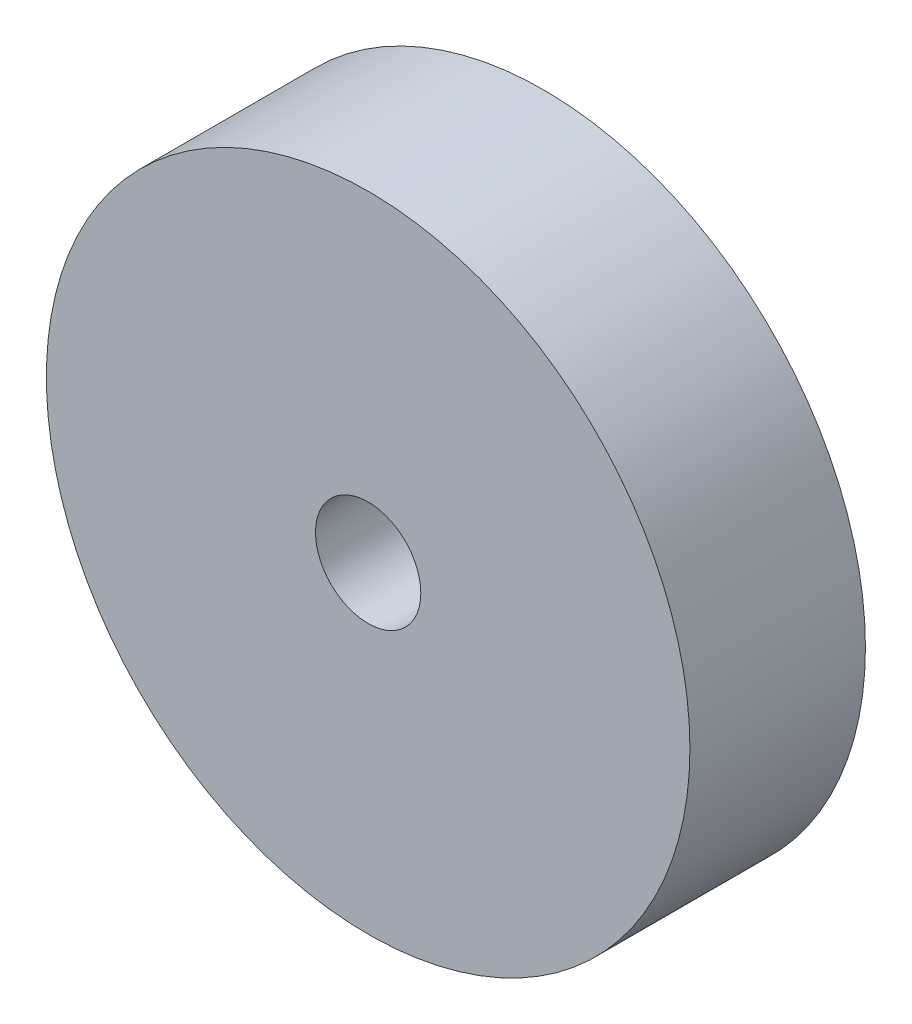
ISO-10303-21;
HEADER;
FILE_DESCRIPTION(('STEP AP214'),'2;1');
FILE_NAME('part.step','',(''),(''),'','','');
FILE_SCHEMA(('AUTOMOTIVE_DESIGN { 1 0 10303 214 1 1 1 1 }'));
ENDSEC;
DATA;
#1=APPLICATION_CONTEXT('core data for automotive mechanical design processes');
#2=APPLICATION_PROTOCOL_DEFINITION('international standard','automotive_design',2000,#1);
#3=PRODUCT_CONTEXT('',#1,'mechanical');
#4=PRODUCT('Part','Part','',(#3));
#5=PRODUCT_RELATED_PRODUCT_CATEGORY('part','',(#4));
#6=PRODUCT_DEFINITION_FORMATION('','',#4);
#7=PRODUCT_DEFINITION_CONTEXT('part definition',#1,'design');
#8=PRODUCT_DEFINITION('design','',#6,#7);
#9=PRODUCT_DEFINITION_SHAPE('','',#8);
#10=(LENGTH_UNIT() NAMED_UNIT(*) SI_UNIT(.MILLI.,.METRE.));
#11=(NAMED_UNIT(*) PLANE_ANGLE_UNIT() SI_UNIT($,.RADIAN.));
#12=(NAMED_UNIT(*) SI_UNIT($,.STERADIAN.) SOLID_ANGLE_UNIT());
#13=UNCERTAINTY_MEASURE_WITH_UNIT(LENGTH_MEASURE(1.E-05),#10,'distance_accuracy_value','');
#14=(GEOMETRIC_REPRESENTATION_CONTEXT(3) GLOBAL_UNCERTAINTY_ASSIGNED_CONTEXT((#13)) GLOBAL_UNIT_ASSIGNED_CONTEXT((#10,
#11,#12)) REPRESENTATION_CONTEXT('',''));
#15=CARTESIAN_POINT('',(0.,0.,0.));
#16=DIRECTION('',(0.,0.,1.));
#17=DIRECTION('',(1.,0.,0.));
#18=AXIS2_PLACEMENT_3D('',#15,#16,#17);
#19=CARTESIAN_POINT('',(0.,0.,3.));
#20=DIRECTION('',(0.,0.,-1.));
#21=DIRECTION('',(-1.,0.,0.));
#22=AXIS2_PLACEMENT_3D('',#19,#20,#21);
#23=CYLINDRICAL_SURFACE('',#22,0.9);
#24=CARTESIAN_POINT('',(0.,0.,3.));
#25=DIRECTION('',(0.,0.,1.));
#26=DIRECTION('',(1.,0.,0.));
#27=AXIS2_PLACEMENT_3D('',#24,#25,#26);
#28=CIRCLE('',#27,0.9);
#29=CARTESIAN_POINT('',(0.9,0.,3.));
#30=VERTEX_POINT('',#29);
#31=EDGE_CURVE('E38',#30,#30,#28,.T.);
#32=ORIENTED_EDGE('',*,*,#31,.T.);
#33=EDGE_LOOP('',(#32));
#34=FACE_BOUND('',#33,.T.);
#35=CARTESIAN_POINT('',(0.,0.,0.));
#36=DIRECTION('',(0.,0.,1.));
#37=DIRECTION('',(1.,0.,0.));
#38=AXIS2_PLACEMENT_3D('',#35,#36,#37);
#39=CIRCLE('',#38,0.9);
#40=CARTESIAN_POINT('',(0.9,0.,0.));
#41=VERTEX_POINT('',#40);
#42=EDGE_CURVE('E44',#41,#41,#39,.T.);
#43=ORIENTED_EDGE('',*,*,#42,.F.);
#44=EDGE_LOOP('',(#43));
#45=FACE_BOUND('',#44,.T.);
#46=ADVANCED_FACE('F31',(#34,#45),#23,.F.);
#47=CARTESIAN_POINT('',(0.,0.,3.));
#48=DIRECTION('',(0.,0.,-1.));
#49=DIRECTION('',(-1.,0.,0.));
#50=AXIS2_PLACEMENT_3D('',#47,#48,#49);
#51=CYLINDRICAL_SURFACE('',#50,5.5);
#52=CARTESIAN_POINT('',(0.,0.,3.));
#53=DIRECTION('',(0.,0.,1.));
#54=DIRECTION('',(1.,0.,0.));
#55=AXIS2_PLACEMENT_3D('',#52,#53,#54);
#56=CIRCLE('',#55,5.5);
#57=CARTESIAN_POINT('',(5.5,0.,3.));
#58=VERTEX_POINT('',#57);
#59=EDGE_CURVE('E10',#58,#58,#56,.T.);
#60=ORIENTED_EDGE('',*,*,#59,.F.);
#61=EDGE_LOOP('',(#60));
#62=FACE_BOUND('',#61,.T.);
#63=CARTESIAN_POINT('',(0.,0.,0.));
#64=DIRECTION('',(0.,0.,1.));
#65=DIRECTION('',(1.,0.,0.));
#66=AXIS2_PLACEMENT_3D('',#63,#64,#65);
#67=CIRCLE('',#66,5.5);
#68=CARTESIAN_POINT('',(5.5,0.,0.));
#69=VERTEX_POINT('',#68);
#70=EDGE_CURVE('E34',#69,#69,#67,.T.);
#71=ORIENTED_EDGE('',*,*,#70,.T.);
#72=EDGE_LOOP('',(#71));
#73=FACE_BOUND('',#72,.T.);
#74=ADVANCED_FACE('F51',(#62,#73),#51,.T.);
#75=CARTESIAN_POINT('',(0.,0.,3.));
#76=DIRECTION('',(0.,0.,1.));
#77=DIRECTION('',(1.,0.,0.));
#78=AXIS2_PLACEMENT_3D('',#75,#76,#77);
#79=PLANE('',#78);
#80=ORIENTED_EDGE('',*,*,#31,.F.);
#81=EDGE_LOOP('',(#80));
#82=FACE_BOUND('',#81,.T.);
#83=ORIENTED_EDGE('',*,*,#59,.T.);
#84=EDGE_LOOP('',(#83));
#85=FACE_BOUND('',#84,.T.);
#86=ADVANCED_FACE('F55',(#82,#85),#79,.T.);
#87=CARTESIAN_POINT('',(0.,0.,0.));
#88=DIRECTION('',(0.,0.,1.));
#89=DIRECTION('',(1.,0.,0.));
#90=AXIS2_PLACEMENT_3D('',#87,#88,#89);
#91=PLANE('',#90);
#92=ORIENTED_EDGE('',*,*,#42,.T.);
#93=EDGE_LOOP('',(#92));
#94=FACE_BOUND('',#93,.T.);
#95=ORIENTED_EDGE('',*,*,#70,.F.);
#96=EDGE_LOOP('',(#95));
#97=FACE_BOUND('',#96,.T.);
#98=ADVANCED_FACE('F53',(#94,#97),#91,.F.);
#99=CLOSED_SHELL('',(#46,#74,#86,#98));
#100=MANIFOLD_SOLID_BREP('B2',#99);
#101=ADVANCED_BREP_SHAPE_REPRESENTATION('',(#18,#100),#14);
#102=SHAPE_DEFINITION_REPRESENTATION(#9,#101);
ENDSEC;
END-ISO-10303-21;
